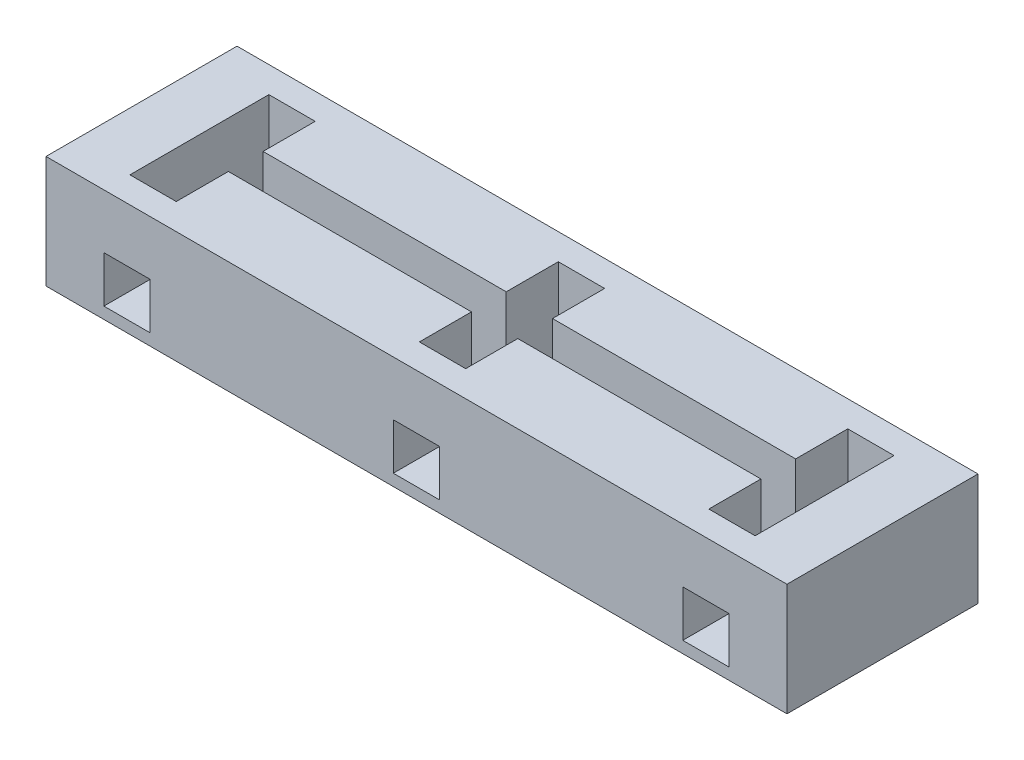
ISO-10303-21;
HEADER;
FILE_DESCRIPTION(('STEP AP214'),'2;1');
FILE_NAME('part.step','',(''),(''),'','','');
FILE_SCHEMA(('AUTOMOTIVE_DESIGN { 1 0 10303 214 1 1 1 1 }'));
ENDSEC;
DATA;
#1=APPLICATION_CONTEXT('core data for automotive mechanical design processes');
#2=APPLICATION_PROTOCOL_DEFINITION('international standard','automotive_design',2000,#1);
#3=PRODUCT_CONTEXT('',#1,'mechanical');
#4=PRODUCT('Part','Part','',(#3));
#5=PRODUCT_RELATED_PRODUCT_CATEGORY('part','',(#4));
#6=PRODUCT_DEFINITION_FORMATION('','',#4);
#7=PRODUCT_DEFINITION_CONTEXT('part definition',#1,'design');
#8=PRODUCT_DEFINITION('design','',#6,#7);
#9=PRODUCT_DEFINITION_SHAPE('','',#8);
#10=(LENGTH_UNIT() NAMED_UNIT(*) SI_UNIT(.MILLI.,.METRE.));
#11=(NAMED_UNIT(*) PLANE_ANGLE_UNIT() SI_UNIT($,.RADIAN.));
#12=(NAMED_UNIT(*) SI_UNIT($,.STERADIAN.) SOLID_ANGLE_UNIT());
#13=UNCERTAINTY_MEASURE_WITH_UNIT(LENGTH_MEASURE(1.E-05),#10,'distance_accuracy_value','');
#14=(GEOMETRIC_REPRESENTATION_CONTEXT(3) GLOBAL_UNCERTAINTY_ASSIGNED_CONTEXT((#13)) GLOBAL_UNIT_ASSIGNED_CONTEXT((#10,
#11,#12)) REPRESENTATION_CONTEXT('',''));
#15=CARTESIAN_POINT('',(0.,0.,0.));
#16=DIRECTION('',(0.,0.,1.));
#17=DIRECTION('',(1.,0.,0.));
#18=AXIS2_PLACEMENT_3D('',#15,#16,#17);
#19=CARTESIAN_POINT('',(-160.,-43.48,41.25));
#20=DIRECTION('',(0.,0.,1.));
#21=DIRECTION('',(1.,0.,0.));
#22=AXIS2_PLACEMENT_3D('',#19,#20,#21);
#23=PLANE('',#22);
#24=DIRECTION('',(-1.,0.,0.));
#25=VECTOR('',#24,1.);
#26=CARTESIAN_POINT('',(-160.,-43.48,41.25));
#27=LINE('',#26,#25);
#28=CARTESIAN_POINT('',(-115.,-43.48,41.25));
#29=VERTEX_POINT('',#28);
#30=CARTESIAN_POINT('',(-135.,-43.48,41.25));
#31=VERTEX_POINT('',#30);
#32=EDGE_CURVE('E261',#29,#31,#27,.T.);
#33=ORIENTED_EDGE('',*,*,#32,.T.);
#34=DIRECTION('',(0.,-1.,0.));
#35=VECTOR('',#34,1.);
#36=CARTESIAN_POINT('',(-135.,-43.48,41.25));
#37=LINE('',#36,#35);
#38=CARTESIAN_POINT('',(-135.,-23.48,41.25));
#39=VERTEX_POINT('',#38);
#40=EDGE_CURVE('E272',#39,#31,#37,.T.);
#41=ORIENTED_EDGE('',*,*,#40,.F.);
#42=DIRECTION('',(-1.,0.,0.));
#43=VECTOR('',#42,1.);
#44=CARTESIAN_POINT('',(-135.,-23.48,41.25));
#45=LINE('',#44,#43);
#46=CARTESIAN_POINT('',(-115.,-23.48,41.25));
#47=VERTEX_POINT('',#46);
#48=EDGE_CURVE('E277',#47,#39,#45,.T.);
#49=ORIENTED_EDGE('',*,*,#48,.F.);
#50=DIRECTION('',(0.,1.,0.));
#51=VECTOR('',#50,1.);
#52=CARTESIAN_POINT('',(-115.,-43.48,41.25));
#53=LINE('',#52,#51);
#54=EDGE_CURVE('E276',#29,#47,#53,.T.);
#55=ORIENTED_EDGE('',*,*,#54,.F.);
#56=EDGE_LOOP('',(#33,#41,#49,#55));
#57=FACE_BOUND('',#56,.T.);
#58=CARTESIAN_POINT('',(9.99999999999998,-43.48,41.25));
#59=VERTEX_POINT('',#58);
#60=CARTESIAN_POINT('',(-10.,-43.48,41.25));
#61=VERTEX_POINT('',#60);
#62=EDGE_CURVE('E264',#59,#61,#27,.T.);
#63=ORIENTED_EDGE('',*,*,#62,.T.);
#64=DIRECTION('',(0.,-1.,0.));
#65=VECTOR('',#64,1.);
#66=CARTESIAN_POINT('',(-10.,-43.48,41.25));
#67=LINE('',#66,#65);
#68=CARTESIAN_POINT('',(-10.,-23.48,41.25));
#69=VERTEX_POINT('',#68);
#70=EDGE_CURVE('E298',#69,#61,#67,.T.);
#71=ORIENTED_EDGE('',*,*,#70,.F.);
#72=DIRECTION('',(-1.,0.,0.));
#73=VECTOR('',#72,1.);
#74=CARTESIAN_POINT('',(-10.,-23.48,41.25));
#75=LINE('',#74,#73);
#76=CARTESIAN_POINT('',(9.99999999999998,-23.48,41.25));
#77=VERTEX_POINT('',#76);
#78=EDGE_CURVE('E295',#77,#69,#75,.T.);
#79=ORIENTED_EDGE('',*,*,#78,.F.);
#80=DIRECTION('',(0.,1.,0.));
#81=VECTOR('',#80,1.);
#82=CARTESIAN_POINT('',(9.99999999999998,-43.48,41.25));
#83=LINE('',#82,#81);
#84=EDGE_CURVE('E284',#59,#77,#83,.T.);
#85=ORIENTED_EDGE('',*,*,#84,.F.);
#86=EDGE_LOOP('',(#63,#71,#79,#85));
#87=FACE_BOUND('',#86,.T.);
#88=DIRECTION('',(-1.,0.,0.));
#89=VECTOR('',#88,1.);
#90=CARTESIAN_POINT('',(-160.,-48.48,41.25));
#91=LINE('',#90,#89);
#92=CARTESIAN_POINT('',(160.,-48.48,41.25));
#93=VERTEX_POINT('',#92);
#94=CARTESIAN_POINT('',(-160.,-48.48,41.25));
#95=VERTEX_POINT('',#94);
#96=EDGE_CURVE('E259',#93,#95,#91,.T.);
#97=ORIENTED_EDGE('',*,*,#96,.F.);
#98=DIRECTION('',(0.,1.,0.));
#99=VECTOR('',#98,1.);
#100=CARTESIAN_POINT('',(160.,-43.48,41.25));
#101=LINE('',#100,#99);
#102=CARTESIAN_POINT('',(160.,0.,41.25));
#103=VERTEX_POINT('',#102);
#104=EDGE_CURVE('E45',#93,#103,#101,.T.);
#105=ORIENTED_EDGE('',*,*,#104,.T.);
#106=DIRECTION('',(1.,0.,0.));
#107=VECTOR('',#106,1.);
#108=CARTESIAN_POINT('',(-160.,0.,41.25));
#109=LINE('',#108,#107);
#110=CARTESIAN_POINT('',(-160.,0.,41.25));
#111=VERTEX_POINT('',#110);
#112=EDGE_CURVE('E423',#111,#103,#109,.T.);
#113=ORIENTED_EDGE('',*,*,#112,.F.);
#114=DIRECTION('',(0.,1.,0.));
#115=VECTOR('',#114,1.);
#116=CARTESIAN_POINT('',(-160.,-43.48,41.25));
#117=LINE('',#116,#115);
#118=EDGE_CURVE('E11',#95,#111,#117,.T.);
#119=ORIENTED_EDGE('',*,*,#118,.F.);
#120=EDGE_LOOP('',(#97,#105,#113,#119));
#121=FACE_BOUND('',#120,.T.);
#122=DIRECTION('',(0.,1.,0.));
#123=VECTOR('',#122,1.);
#124=CARTESIAN_POINT('',(135.,-43.48,41.25));
#125=LINE('',#124,#123);
#126=CARTESIAN_POINT('',(135.,-43.48,41.25));
#127=VERTEX_POINT('',#126);
#128=CARTESIAN_POINT('',(135.,-23.48,41.25));
#129=VERTEX_POINT('',#128);
#130=EDGE_CURVE('E274',#127,#129,#125,.T.);
#131=ORIENTED_EDGE('',*,*,#130,.F.);
#132=CARTESIAN_POINT('',(115.,-43.48,41.25));
#133=VERTEX_POINT('',#132);
#134=EDGE_CURVE('E256',#127,#133,#27,.T.);
#135=ORIENTED_EDGE('',*,*,#134,.T.);
#136=DIRECTION('',(0.,-1.,0.));
#137=VECTOR('',#136,1.);
#138=CARTESIAN_POINT('',(115.,-43.48,41.25));
#139=LINE('',#138,#137);
#140=CARTESIAN_POINT('',(115.,-23.48,41.25));
#141=VERTEX_POINT('',#140);
#142=EDGE_CURVE('E283',#141,#133,#139,.T.);
#143=ORIENTED_EDGE('',*,*,#142,.F.);
#144=DIRECTION('',(-1.,0.,0.));
#145=VECTOR('',#144,1.);
#146=CARTESIAN_POINT('',(135.,-23.48,41.25));
#147=LINE('',#146,#145);
#148=EDGE_CURVE('E289',#129,#141,#147,.T.);
#149=ORIENTED_EDGE('',*,*,#148,.F.);
#150=EDGE_LOOP('',(#131,#135,#143,#149));
#151=FACE_BOUND('',#150,.T.);
#152=ADVANCED_FACE('F39',(#57,#87,#121,#151),#23,.T.);
#153=CARTESIAN_POINT('',(-160.,-43.48,41.25));
#154=DIRECTION('',(-1.,0.,0.));
#155=DIRECTION('',(0.,0.,1.));
#156=AXIS2_PLACEMENT_3D('',#153,#154,#155);
#157=PLANE('',#156);
#158=DIRECTION('',(0.,0.,1.));
#159=VECTOR('',#158,1.);
#160=CARTESIAN_POINT('',(-160.,0.,41.25));
#161=LINE('',#160,#159);
#162=CARTESIAN_POINT('',(-160.,0.,-41.25));
#163=VERTEX_POINT('',#162);
#164=EDGE_CURVE('E241',#163,#111,#161,.T.);
#165=ORIENTED_EDGE('',*,*,#164,.F.);
#166=DIRECTION('',(0.,1.,0.));
#167=VECTOR('',#166,1.);
#168=CARTESIAN_POINT('',(-160.,-43.48,-41.25));
#169=LINE('',#168,#167);
#170=CARTESIAN_POINT('',(-160.,-48.48,-41.25));
#171=VERTEX_POINT('',#170);
#172=EDGE_CURVE('E50',#171,#163,#169,.T.);
#173=ORIENTED_EDGE('',*,*,#172,.F.);
#174=DIRECTION('',(0.,0.,-1.));
#175=VECTOR('',#174,1.);
#176=CARTESIAN_POINT('',(-160.,-48.48,41.25));
#177=LINE('',#176,#175);
#178=EDGE_CURVE('E237',#95,#171,#177,.T.);
#179=ORIENTED_EDGE('',*,*,#178,.F.);
#180=ORIENTED_EDGE('',*,*,#118,.T.);
#181=EDGE_LOOP('',(#165,#173,#179,#180));
#182=FACE_BOUND('',#181,.T.);
#183=ADVANCED_FACE('F240',(#182),#157,.T.);
#184=CARTESIAN_POINT('',(-160.,-43.48,-41.25));
#185=DIRECTION('',(0.,0.,-1.));
#186=DIRECTION('',(-1.,0.,0.));
#187=AXIS2_PLACEMENT_3D('',#184,#185,#186);
#188=PLANE('',#187);
#189=DIRECTION('',(-1.,0.,0.));
#190=VECTOR('',#189,1.);
#191=CARTESIAN_POINT('',(-160.,0.,-41.25));
#192=LINE('',#191,#190);
#193=CARTESIAN_POINT('',(160.,0.,-41.25));
#194=VERTEX_POINT('',#193);
#195=EDGE_CURVE('E465',#194,#163,#192,.T.);
#196=ORIENTED_EDGE('',*,*,#195,.F.);
#197=DIRECTION('',(0.,1.,0.));
#198=VECTOR('',#197,1.);
#199=CARTESIAN_POINT('',(160.,-43.48,-41.25));
#200=LINE('',#199,#198);
#201=CARTESIAN_POINT('',(160.,-48.48,-41.25));
#202=VERTEX_POINT('',#201);
#203=EDGE_CURVE('E244',#202,#194,#200,.T.);
#204=ORIENTED_EDGE('',*,*,#203,.F.);
#205=DIRECTION('',(1.,0.,0.));
#206=VECTOR('',#205,1.);
#207=CARTESIAN_POINT('',(-160.,-48.48,-41.25));
#208=LINE('',#207,#206);
#209=EDGE_CURVE('E247',#171,#202,#208,.T.);
#210=ORIENTED_EDGE('',*,*,#209,.F.);
#211=ORIENTED_EDGE('',*,*,#172,.T.);
#212=EDGE_LOOP('',(#196,#204,#210,#211));
#213=FACE_BOUND('',#212,.T.);
#214=ADVANCED_FACE('F248',(#213),#188,.T.);
#215=CARTESIAN_POINT('',(160.,-43.48,41.25));
#216=DIRECTION('',(1.,0.,0.));
#217=DIRECTION('',(0.,0.,-1.));
#218=AXIS2_PLACEMENT_3D('',#215,#216,#217);
#219=PLANE('',#218);
#220=DIRECTION('',(0.,0.,-1.));
#221=VECTOR('',#220,1.);
#222=CARTESIAN_POINT('',(160.,0.,41.25));
#223=LINE('',#222,#221);
#224=EDGE_CURVE('E462',#103,#194,#223,.T.);
#225=ORIENTED_EDGE('',*,*,#224,.F.);
#226=ORIENTED_EDGE('',*,*,#104,.F.);
#227=DIRECTION('',(0.,0.,1.));
#228=VECTOR('',#227,1.);
#229=CARTESIAN_POINT('',(160.,-48.48,41.25));
#230=LINE('',#229,#228);
#231=EDGE_CURVE('E254',#202,#93,#230,.T.);
#232=ORIENTED_EDGE('',*,*,#231,.F.);
#233=ORIENTED_EDGE('',*,*,#203,.T.);
#234=EDGE_LOOP('',(#225,#226,#232,#233));
#235=FACE_BOUND('',#234,.T.);
#236=ADVANCED_FACE('F475',(#235),#219,.T.);
#237=CARTESIAN_POINT('',(0.,0.,0.));
#238=DIRECTION('',(0.,1.,0.));
#239=DIRECTION('',(0.,0.,1.));
#240=AXIS2_PLACEMENT_3D('',#237,#238,#239);
#241=PLANE('',#240);
#242=DIRECTION('',(-1.,0.,0.));
#243=VECTOR('',#242,1.);
#244=CARTESIAN_POINT('',(115.,0.,-7.49999999999994));
#245=LINE('',#244,#243);
#246=CARTESIAN_POINT('',(115.,0.,-7.49999999999994));
#247=VERTEX_POINT('',#246);
#248=CARTESIAN_POINT('',(9.99999999999994,0.,-7.50000000000011));
#249=VERTEX_POINT('',#248);
#250=EDGE_CURVE('E308',#247,#249,#245,.T.);
#251=ORIENTED_EDGE('',*,*,#250,.F.);
#252=DIRECTION('',(0.,0.,1.));
#253=VECTOR('',#252,1.);
#254=CARTESIAN_POINT('',(115.,0.,-30.));
#255=LINE('',#254,#253);
#256=CARTESIAN_POINT('',(115.,0.,-30.));
#257=VERTEX_POINT('',#256);
#258=EDGE_CURVE('E312',#257,#247,#255,.T.);
#259=ORIENTED_EDGE('',*,*,#258,.F.);
#260=DIRECTION('',(-1.,0.,0.));
#261=VECTOR('',#260,1.);
#262=CARTESIAN_POINT('',(135.,0.,-30.));
#263=LINE('',#262,#261);
#264=CARTESIAN_POINT('',(135.,0.,-30.));
#265=VERTEX_POINT('',#264);
#266=EDGE_CURVE('E411',#265,#257,#263,.T.);
#267=ORIENTED_EDGE('',*,*,#266,.F.);
#268=DIRECTION('',(0.,0.,-1.));
#269=VECTOR('',#268,1.);
#270=CARTESIAN_POINT('',(135.,0.,-30.));
#271=LINE('',#270,#269);
#272=CARTESIAN_POINT('',(135.,0.,30.));
#273=VERTEX_POINT('',#272);
#274=EDGE_CURVE('E412',#273,#265,#271,.T.);
#275=ORIENTED_EDGE('',*,*,#274,.F.);
#276=DIRECTION('',(1.,0.,0.));
#277=VECTOR('',#276,1.);
#278=CARTESIAN_POINT('',(135.,0.,30.));
#279=LINE('',#278,#277);
#280=CARTESIAN_POINT('',(115.,0.,30.));
#281=VERTEX_POINT('',#280);
#282=EDGE_CURVE('E409',#281,#273,#279,.T.);
#283=ORIENTED_EDGE('',*,*,#282,.F.);
#284=DIRECTION('',(0.,0.,1.));
#285=VECTOR('',#284,1.);
#286=CARTESIAN_POINT('',(115.,0.,30.));
#287=LINE('',#286,#285);
#288=CARTESIAN_POINT('',(115.,0.,7.49999999999994));
#289=VERTEX_POINT('',#288);
#290=EDGE_CURVE('E403',#289,#281,#287,.T.);
#291=ORIENTED_EDGE('',*,*,#290,.F.);
#292=DIRECTION('',(1.,0.,0.));
#293=VECTOR('',#292,1.);
#294=CARTESIAN_POINT('',(115.,0.,7.49999999999994));
#295=LINE('',#294,#293);
#296=CARTESIAN_POINT('',(9.99999999999994,0.,7.50000000000011));
#297=VERTEX_POINT('',#296);
#298=EDGE_CURVE('E405',#297,#289,#295,.T.);
#299=ORIENTED_EDGE('',*,*,#298,.F.);
#300=DIRECTION('',(0.,0.,-1.));
#301=VECTOR('',#300,1.);
#302=CARTESIAN_POINT('',(9.99999999999979,0.,30.0000000000001));
#303=LINE('',#302,#301);
#304=CARTESIAN_POINT('',(9.99999999999979,0.,30.0000000000001));
#305=VERTEX_POINT('',#304);
#306=EDGE_CURVE('E398',#305,#297,#303,.T.);
#307=ORIENTED_EDGE('',*,*,#306,.F.);
#308=DIRECTION('',(1.,0.,0.));
#309=VECTOR('',#308,1.);
#310=CARTESIAN_POINT('',(-10.,0.,30.));
#311=LINE('',#310,#309);
#312=CARTESIAN_POINT('',(-10.,0.,30.));
#313=VERTEX_POINT('',#312);
#314=EDGE_CURVE('E396',#313,#305,#311,.T.);
#315=ORIENTED_EDGE('',*,*,#314,.F.);
#316=DIRECTION('',(0.,0.,1.));
#317=VECTOR('',#316,1.);
#318=CARTESIAN_POINT('',(-10.,0.,30.));
#319=LINE('',#318,#317);
#320=CARTESIAN_POINT('',(-10.,0.,7.5));
#321=VERTEX_POINT('',#320);
#322=EDGE_CURVE('E395',#321,#313,#319,.T.);
#323=ORIENTED_EDGE('',*,*,#322,.F.);
#324=DIRECTION('',(1.,0.,0.));
#325=VECTOR('',#324,1.);
#326=CARTESIAN_POINT('',(-115.,0.,7.49999999999994));
#327=LINE('',#326,#325);
#328=CARTESIAN_POINT('',(-115.,0.,7.49999999999994));
#329=VERTEX_POINT('',#328);
#330=EDGE_CURVE('E388',#329,#321,#327,.T.);
#331=ORIENTED_EDGE('',*,*,#330,.F.);
#332=DIRECTION('',(0.,0.,-1.));
#333=VECTOR('',#332,1.);
#334=CARTESIAN_POINT('',(-115.,0.,30.));
#335=LINE('',#334,#333);
#336=CARTESIAN_POINT('',(-115.,0.,30.));
#337=VERTEX_POINT('',#336);
#338=EDGE_CURVE('E390',#337,#329,#335,.T.);
#339=ORIENTED_EDGE('',*,*,#338,.F.);
#340=DIRECTION('',(1.,0.,0.));
#341=VECTOR('',#340,1.);
#342=CARTESIAN_POINT('',(-135.,0.,30.));
#343=LINE('',#342,#341);
#344=CARTESIAN_POINT('',(-135.,0.,30.));
#345=VERTEX_POINT('',#344);
#346=EDGE_CURVE('E381',#345,#337,#343,.T.);
#347=ORIENTED_EDGE('',*,*,#346,.F.);
#348=DIRECTION('',(0.,0.,1.));
#349=VECTOR('',#348,1.);
#350=CARTESIAN_POINT('',(-135.,0.,-30.));
#351=LINE('',#350,#349);
#352=CARTESIAN_POINT('',(-135.,0.,-30.));
#353=VERTEX_POINT('',#352);
#354=EDGE_CURVE('E382',#353,#345,#351,.T.);
#355=ORIENTED_EDGE('',*,*,#354,.F.);
#356=DIRECTION('',(-1.,0.,0.));
#357=VECTOR('',#356,1.);
#358=CARTESIAN_POINT('',(-135.,0.,-30.));
#359=LINE('',#358,#357);
#360=CARTESIAN_POINT('',(-115.,0.,-30.));
#361=VERTEX_POINT('',#360);
#362=EDGE_CURVE('E377',#361,#353,#359,.T.);
#363=ORIENTED_EDGE('',*,*,#362,.F.);
#364=DIRECTION('',(0.,0.,-1.));
#365=VECTOR('',#364,1.);
#366=CARTESIAN_POINT('',(-115.,0.,-30.));
#367=LINE('',#366,#365);
#368=CARTESIAN_POINT('',(-115.,0.,-7.49999999999994));
#369=VERTEX_POINT('',#368);
#370=EDGE_CURVE('E374',#369,#361,#367,.T.);
#371=ORIENTED_EDGE('',*,*,#370,.F.);
#372=DIRECTION('',(-1.,0.,0.));
#373=VECTOR('',#372,1.);
#374=CARTESIAN_POINT('',(-115.,0.,-7.49999999999994));
#375=LINE('',#374,#373);
#376=CARTESIAN_POINT('',(-10.,0.,-7.5));
#377=VERTEX_POINT('',#376);
#378=EDGE_CURVE('E375',#377,#369,#375,.T.);
#379=ORIENTED_EDGE('',*,*,#378,.F.);
#380=DIRECTION('',(0.,0.,1.));
#381=VECTOR('',#380,1.);
#382=CARTESIAN_POINT('',(-10.,0.,-30.));
#383=LINE('',#382,#381);
#384=CARTESIAN_POINT('',(-10.,0.,-30.));
#385=VERTEX_POINT('',#384);
#386=EDGE_CURVE('E367',#385,#377,#383,.T.);
#387=ORIENTED_EDGE('',*,*,#386,.F.);
#388=DIRECTION('',(-1.,0.,0.));
#389=VECTOR('',#388,1.);
#390=CARTESIAN_POINT('',(-10.,0.,-30.));
#391=LINE('',#390,#389);
#392=CARTESIAN_POINT('',(9.99999999999979,0.,-30.0000000000001));
#393=VERTEX_POINT('',#392);
#394=EDGE_CURVE('E366',#393,#385,#391,.T.);
#395=ORIENTED_EDGE('',*,*,#394,.F.);
#396=DIRECTION('',(0.,0.,-1.));
#397=VECTOR('',#396,1.);
#398=CARTESIAN_POINT('',(9.99999999999979,0.,-30.0000000000001));
#399=LINE('',#398,#397);
#400=EDGE_CURVE('E361',#249,#393,#399,.T.);
#401=ORIENTED_EDGE('',*,*,#400,.F.);
#402=EDGE_LOOP('',(#251,#259,#267,#275,#283,#291,#299,#307,#315,#323,#331,#339,#347,#355,#363,
#371,#379,#387,#395,#401));
#403=FACE_BOUND('',#402,.T.);
#404=ORIENTED_EDGE('',*,*,#112,.T.);
#405=ORIENTED_EDGE('',*,*,#224,.T.);
#406=ORIENTED_EDGE('',*,*,#195,.T.);
#407=ORIENTED_EDGE('',*,*,#164,.T.);
#408=EDGE_LOOP('',(#404,#405,#406,#407));
#409=FACE_BOUND('',#408,.T.);
#410=ADVANCED_FACE('F471',(#403,#409),#241,.T.);
#411=CARTESIAN_POINT('',(115.,-43.48,-7.49999999999994));
#412=DIRECTION('',(0.,0.,-1.));
#413=DIRECTION('',(-1.,0.,0.));
#414=AXIS2_PLACEMENT_3D('',#411,#412,#413);
#415=PLANE('',#414);
#416=ORIENTED_EDGE('',*,*,#250,.T.);
#417=DIRECTION('',(0.,1.,0.));
#418=VECTOR('',#417,1.);
#419=CARTESIAN_POINT('',(9.99999999999994,-43.48,-7.50000000000011));
#420=LINE('',#419,#418);
#421=CARTESIAN_POINT('',(9.99999999999994,-43.48,-7.50000000000011));
#422=VERTEX_POINT('',#421);
#423=EDGE_CURVE('E363',#422,#249,#420,.T.);
#424=ORIENTED_EDGE('',*,*,#423,.F.);
#425=DIRECTION('',(-1.,0.,0.));
#426=VECTOR('',#425,1.);
#427=CARTESIAN_POINT('',(115.,-43.48,-7.49999999999994));
#428=LINE('',#427,#426);
#429=CARTESIAN_POINT('',(115.,-43.48,-7.49999999999994));
#430=VERTEX_POINT('',#429);
#431=EDGE_CURVE('E307',#430,#422,#428,.T.);
#432=ORIENTED_EDGE('',*,*,#431,.F.);
#433=DIRECTION('',(0.,1.,0.));
#434=VECTOR('',#433,1.);
#435=CARTESIAN_POINT('',(115.,-43.48,-7.49999999999994));
#436=LINE('',#435,#434);
#437=EDGE_CURVE('E418',#430,#247,#436,.T.);
#438=ORIENTED_EDGE('',*,*,#437,.T.);
#439=EDGE_LOOP('',(#416,#424,#432,#438));
#440=FACE_BOUND('',#439,.T.);
#441=ADVANCED_FACE('F477',(#440),#415,.F.);
#442=CARTESIAN_POINT('',(115.,-43.48,-30.));
#443=DIRECTION('',(-1.,0.,0.));
#444=DIRECTION('',(0.,0.,1.));
#445=AXIS2_PLACEMENT_3D('',#442,#443,#444);
#446=PLANE('',#445);
#447=ORIENTED_EDGE('',*,*,#258,.T.);
#448=ORIENTED_EDGE('',*,*,#437,.F.);
#449=DIRECTION('',(0.,0.,1.));
#450=VECTOR('',#449,1.);
#451=CARTESIAN_POINT('',(115.,-43.48,-30.));
#452=LINE('',#451,#450);
#453=CARTESIAN_POINT('',(115.,-43.48,-30.));
#454=VERTEX_POINT('',#453);
#455=EDGE_CURVE('E356',#454,#430,#452,.T.);
#456=ORIENTED_EDGE('',*,*,#455,.F.);
#457=DIRECTION('',(0.,1.,0.));
#458=VECTOR('',#457,1.);
#459=CARTESIAN_POINT('',(115.,-43.48,-30.));
#460=LINE('',#459,#458);
#461=EDGE_CURVE('E422',#454,#257,#460,.T.);
#462=ORIENTED_EDGE('',*,*,#461,.T.);
#463=EDGE_LOOP('',(#447,#448,#456,#462));
#464=FACE_BOUND('',#463,.T.);
#465=ADVANCED_FACE('F484',(#464),#446,.F.);
#466=CARTESIAN_POINT('',(135.,-43.48,-30.));
#467=DIRECTION('',(0.,0.,-1.));
#468=DIRECTION('',(-1.,0.,0.));
#469=AXIS2_PLACEMENT_3D('',#466,#467,#468);
#470=PLANE('',#469);
#471=ORIENTED_EDGE('',*,*,#266,.T.);
#472=ORIENTED_EDGE('',*,*,#461,.F.);
#473=DIRECTION('',(-1.,0.,0.));
#474=VECTOR('',#473,1.);
#475=CARTESIAN_POINT('',(135.,-43.48,-30.));
#476=LINE('',#475,#474);
#477=CARTESIAN_POINT('',(135.,-43.48,-30.));
#478=VERTEX_POINT('',#477);
#479=EDGE_CURVE('E355',#478,#454,#476,.T.);
#480=ORIENTED_EDGE('',*,*,#479,.F.);
#481=DIRECTION('',(0.,1.,0.));
#482=VECTOR('',#481,1.);
#483=CARTESIAN_POINT('',(135.,-43.48,-30.));
#484=LINE('',#483,#482);
#485=EDGE_CURVE('E425',#478,#265,#484,.T.);
#486=ORIENTED_EDGE('',*,*,#485,.T.);
#487=EDGE_LOOP('',(#471,#472,#480,#486));
#488=FACE_BOUND('',#487,.T.);
#489=ADVANCED_FACE('F534',(#488),#470,.F.);
#490=CARTESIAN_POINT('',(135.,-43.48,-30.));
#491=DIRECTION('',(1.,0.,0.));
#492=DIRECTION('',(0.,0.,-1.));
#493=AXIS2_PLACEMENT_3D('',#490,#491,#492);
#494=PLANE('',#493);
#495=DIRECTION('',(0.,0.,1.));
#496=VECTOR('',#495,1.);
#497=CARTESIAN_POINT('',(135.,-23.48,26.25));
#498=LINE('',#497,#496);
#499=CARTESIAN_POINT('',(135.,-23.48,30.));
#500=VERTEX_POINT('',#499);
#501=EDGE_CURVE('E285',#500,#129,#498,.T.);
#502=ORIENTED_EDGE('',*,*,#501,.F.);
#503=DIRECTION('',(0.,1.,0.));
#504=VECTOR('',#503,1.);
#505=CARTESIAN_POINT('',(135.,-43.48,30.));
#506=LINE('',#505,#504);
#507=EDGE_CURVE('E428',#500,#273,#506,.T.);
#508=ORIENTED_EDGE('',*,*,#507,.T.);
#509=ORIENTED_EDGE('',*,*,#274,.T.);
#510=ORIENTED_EDGE('',*,*,#485,.F.);
#511=DIRECTION('',(0.,0.,-1.));
#512=VECTOR('',#511,1.);
#513=CARTESIAN_POINT('',(135.,-43.48,-30.));
#514=LINE('',#513,#512);
#515=EDGE_CURVE('E352',#127,#478,#514,.T.);
#516=ORIENTED_EDGE('',*,*,#515,.F.);
#517=ORIENTED_EDGE('',*,*,#130,.T.);
#518=EDGE_LOOP('',(#502,#508,#509,#510,#516,#517));
#519=FACE_BOUND('',#518,.T.);
#520=ADVANCED_FACE('F528',(#519),#494,.F.);
#521=CARTESIAN_POINT('',(135.,-43.48,30.));
#522=DIRECTION('',(0.,0.,1.));
#523=DIRECTION('',(1.,0.,0.));
#524=AXIS2_PLACEMENT_3D('',#521,#522,#523);
#525=PLANE('',#524);
#526=ORIENTED_EDGE('',*,*,#507,.F.);
#527=DIRECTION('',(-1.,0.,0.));
#528=VECTOR('',#527,1.);
#529=CARTESIAN_POINT('',(135.,-23.48,30.));
#530=LINE('',#529,#528);
#531=CARTESIAN_POINT('',(115.,-23.48,30.));
#532=VERTEX_POINT('',#531);
#533=EDGE_CURVE('E306',#500,#532,#530,.T.);
#534=ORIENTED_EDGE('',*,*,#533,.T.);
#535=DIRECTION('',(0.,1.,0.));
#536=VECTOR('',#535,1.);
#537=CARTESIAN_POINT('',(115.,-43.48,30.));
#538=LINE('',#537,#536);
#539=EDGE_CURVE('E426',#532,#281,#538,.T.);
#540=ORIENTED_EDGE('',*,*,#539,.T.);
#541=ORIENTED_EDGE('',*,*,#282,.T.);
#542=EDGE_LOOP('',(#526,#534,#540,#541));
#543=FACE_BOUND('',#542,.T.);
#544=ADVANCED_FACE('F632',(#543),#525,.F.);
#545=CARTESIAN_POINT('',(115.,-43.48,30.));
#546=DIRECTION('',(-1.,0.,0.));
#547=DIRECTION('',(0.,0.,1.));
#548=AXIS2_PLACEMENT_3D('',#545,#546,#547);
#549=PLANE('',#548);
#550=ORIENTED_EDGE('',*,*,#539,.F.);
#551=DIRECTION('',(0.,0.,1.));
#552=VECTOR('',#551,1.);
#553=CARTESIAN_POINT('',(115.,-23.48,26.25));
#554=LINE('',#553,#552);
#555=EDGE_CURVE('E54',#532,#141,#554,.T.);
#556=ORIENTED_EDGE('',*,*,#555,.T.);
#557=ORIENTED_EDGE('',*,*,#142,.T.);
#558=DIRECTION('',(0.,0.,1.));
#559=VECTOR('',#558,1.);
#560=CARTESIAN_POINT('',(115.,-43.48,30.));
#561=LINE('',#560,#559);
#562=CARTESIAN_POINT('',(115.,-43.48,7.49999999999994));
#563=VERTEX_POINT('',#562);
#564=EDGE_CURVE('E346',#563,#133,#561,.T.);
#565=ORIENTED_EDGE('',*,*,#564,.F.);
#566=DIRECTION('',(0.,1.,0.));
#567=VECTOR('',#566,1.);
#568=CARTESIAN_POINT('',(115.,-43.48,7.49999999999994));
#569=LINE('',#568,#567);
#570=EDGE_CURVE('E427',#563,#289,#569,.T.);
#571=ORIENTED_EDGE('',*,*,#570,.T.);
#572=ORIENTED_EDGE('',*,*,#290,.T.);
#573=EDGE_LOOP('',(#550,#556,#557,#565,#571,#572));
#574=FACE_BOUND('',#573,.T.);
#575=ADVANCED_FACE('F636',(#574),#549,.F.);
#576=CARTESIAN_POINT('',(115.,-43.48,7.49999999999994));
#577=DIRECTION('',(0.,0.,1.));
#578=DIRECTION('',(1.,0.,0.));
#579=AXIS2_PLACEMENT_3D('',#576,#577,#578);
#580=PLANE('',#579);
#581=ORIENTED_EDGE('',*,*,#298,.T.);
#582=ORIENTED_EDGE('',*,*,#570,.F.);
#583=DIRECTION('',(1.,0.,0.));
#584=VECTOR('',#583,1.);
#585=CARTESIAN_POINT('',(115.,-43.48,7.49999999999994));
#586=LINE('',#585,#584);
#587=CARTESIAN_POINT('',(9.99999999999994,-43.48,7.50000000000012));
#588=VERTEX_POINT('',#587);
#589=EDGE_CURVE('E347',#588,#563,#586,.T.);
#590=ORIENTED_EDGE('',*,*,#589,.F.);
#591=DIRECTION('',(0.,1.,0.));
#592=VECTOR('',#591,1.);
#593=CARTESIAN_POINT('',(9.99999999999994,-43.48,7.50000000000011));
#594=LINE('',#593,#592);
#595=EDGE_CURVE('E435',#588,#297,#594,.T.);
#596=ORIENTED_EDGE('',*,*,#595,.T.);
#597=EDGE_LOOP('',(#581,#582,#590,#596));
#598=FACE_BOUND('',#597,.T.);
#599=ADVANCED_FACE('F516',(#598),#580,.F.);
#600=CARTESIAN_POINT('',(9.99999999999979,-43.48,30.0000000000001));
#601=DIRECTION('',(1.,0.,0.));
#602=DIRECTION('',(0.,0.,-1.));
#603=AXIS2_PLACEMENT_3D('',#600,#601,#602);
#604=PLANE('',#603);
#605=DIRECTION('',(0.,0.,1.));
#606=VECTOR('',#605,1.);
#607=CARTESIAN_POINT('',(9.99999999999998,-23.48,26.25));
#608=LINE('',#607,#606);
#609=CARTESIAN_POINT('',(9.99999999999998,-23.48,30.0000000000001));
#610=VERTEX_POINT('',#609);
#611=EDGE_CURVE('E296',#610,#77,#608,.T.);
#612=ORIENTED_EDGE('',*,*,#611,.F.);
#613=DIRECTION('',(0.,1.,0.));
#614=VECTOR('',#613,1.);
#615=CARTESIAN_POINT('',(9.99999999999979,-43.48,30.0000000000001));
#616=LINE('',#615,#614);
#617=EDGE_CURVE('E432',#610,#305,#616,.T.);
#618=ORIENTED_EDGE('',*,*,#617,.T.);
#619=ORIENTED_EDGE('',*,*,#306,.T.);
#620=ORIENTED_EDGE('',*,*,#595,.F.);
#621=DIRECTION('',(0.,0.,-1.));
#622=VECTOR('',#621,1.);
#623=CARTESIAN_POINT('',(9.99999999999979,-43.48,30.0000000000001));
#624=LINE('',#623,#622);
#625=EDGE_CURVE('E344',#59,#588,#624,.T.);
#626=ORIENTED_EDGE('',*,*,#625,.F.);
#627=ORIENTED_EDGE('',*,*,#84,.T.);
#628=EDGE_LOOP('',(#612,#618,#619,#620,#626,#627));
#629=FACE_BOUND('',#628,.T.);
#630=ADVANCED_FACE('F511',(#629),#604,.F.);
#631=CARTESIAN_POINT('',(-10.,-43.48,30.));
#632=DIRECTION('',(0.,0.,1.));
#633=DIRECTION('',(1.,0.,0.));
#634=AXIS2_PLACEMENT_3D('',#631,#632,#633);
#635=PLANE('',#634);
#636=ORIENTED_EDGE('',*,*,#617,.F.);
#637=DIRECTION('',(-1.,0.,0.));
#638=VECTOR('',#637,1.);
#639=CARTESIAN_POINT('',(-10.,-23.48,30.));
#640=LINE('',#639,#638);
#641=CARTESIAN_POINT('',(-10.,-23.48,30.));
#642=VERTEX_POINT('',#641);
#643=EDGE_CURVE('E302',#610,#642,#640,.T.);
#644=ORIENTED_EDGE('',*,*,#643,.T.);
#645=DIRECTION('',(0.,1.,0.));
#646=VECTOR('',#645,1.);
#647=CARTESIAN_POINT('',(-10.,-43.48,30.));
#648=LINE('',#647,#646);
#649=EDGE_CURVE('E436',#642,#313,#648,.T.);
#650=ORIENTED_EDGE('',*,*,#649,.T.);
#651=ORIENTED_EDGE('',*,*,#314,.T.);
#652=EDGE_LOOP('',(#636,#644,#650,#651));
#653=FACE_BOUND('',#652,.T.);
#654=ADVANCED_FACE('F585',(#653),#635,.F.);
#655=CARTESIAN_POINT('',(-10.,-43.48,30.));
#656=DIRECTION('',(-1.,0.,0.));
#657=DIRECTION('',(0.,0.,1.));
#658=AXIS2_PLACEMENT_3D('',#655,#656,#657);
#659=PLANE('',#658);
#660=ORIENTED_EDGE('',*,*,#649,.F.);
#661=DIRECTION('',(0.,0.,1.));
#662=VECTOR('',#661,1.);
#663=CARTESIAN_POINT('',(-10.,-23.48,26.25));
#664=LINE('',#663,#662);
#665=EDGE_CURVE('E64',#642,#69,#664,.T.);
#666=ORIENTED_EDGE('',*,*,#665,.T.);
#667=ORIENTED_EDGE('',*,*,#70,.T.);
#668=DIRECTION('',(0.,0.,1.));
#669=VECTOR('',#668,1.);
#670=CARTESIAN_POINT('',(-10.,-43.48,30.));
#671=LINE('',#670,#669);
#672=CARTESIAN_POINT('',(-10.,-43.48,7.5));
#673=VERTEX_POINT('',#672);
#674=EDGE_CURVE('E338',#673,#61,#671,.T.);
#675=ORIENTED_EDGE('',*,*,#674,.F.);
#676=DIRECTION('',(0.,1.,0.));
#677=VECTOR('',#676,1.);
#678=CARTESIAN_POINT('',(-10.,-43.48,7.5));
#679=LINE('',#678,#677);
#680=EDGE_CURVE('E438',#673,#321,#679,.T.);
#681=ORIENTED_EDGE('',*,*,#680,.T.);
#682=ORIENTED_EDGE('',*,*,#322,.T.);
#683=EDGE_LOOP('',(#660,#666,#667,#675,#681,#682));
#684=FACE_BOUND('',#683,.T.);
#685=ADVANCED_FACE('F508',(#684),#659,.F.);
#686=CARTESIAN_POINT('',(-115.,-43.48,7.49999999999994));
#687=DIRECTION('',(0.,0.,1.));
#688=DIRECTION('',(1.,0.,0.));
#689=AXIS2_PLACEMENT_3D('',#686,#687,#688);
#690=PLANE('',#689);
#691=ORIENTED_EDGE('',*,*,#330,.T.);
#692=ORIENTED_EDGE('',*,*,#680,.F.);
#693=DIRECTION('',(1.,0.,0.));
#694=VECTOR('',#693,1.);
#695=CARTESIAN_POINT('',(-115.,-43.48,7.49999999999994));
#696=LINE('',#695,#694);
#697=CARTESIAN_POINT('',(-115.,-43.48,7.49999999999994));
#698=VERTEX_POINT('',#697);
#699=EDGE_CURVE('E340',#698,#673,#696,.T.);
#700=ORIENTED_EDGE('',*,*,#699,.F.);
#701=DIRECTION('',(0.,1.,0.));
#702=VECTOR('',#701,1.);
#703=CARTESIAN_POINT('',(-115.,-43.48,7.49999999999994));
#704=LINE('',#703,#702);
#705=EDGE_CURVE('E439',#698,#329,#704,.T.);
#706=ORIENTED_EDGE('',*,*,#705,.T.);
#707=EDGE_LOOP('',(#691,#692,#700,#706));
#708=FACE_BOUND('',#707,.T.);
#709=ADVANCED_FACE('F579',(#708),#690,.F.);
#710=CARTESIAN_POINT('',(-115.,-43.48,30.));
#711=DIRECTION('',(1.,0.,0.));
#712=DIRECTION('',(0.,0.,-1.));
#713=AXIS2_PLACEMENT_3D('',#710,#711,#712);
#714=PLANE('',#713);
#715=DIRECTION('',(0.,0.,1.));
#716=VECTOR('',#715,1.);
#717=CARTESIAN_POINT('',(-115.,-23.48,26.25));
#718=LINE('',#717,#716);
#719=CARTESIAN_POINT('',(-115.,-23.48,30.));
#720=VERTEX_POINT('',#719);
#721=EDGE_CURVE('E268',#720,#47,#718,.T.);
#722=ORIENTED_EDGE('',*,*,#721,.F.);
#723=DIRECTION('',(0.,1.,0.));
#724=VECTOR('',#723,1.);
#725=CARTESIAN_POINT('',(-115.,-43.48,30.));
#726=LINE('',#725,#724);
#727=EDGE_CURVE('E445',#720,#337,#726,.T.);
#728=ORIENTED_EDGE('',*,*,#727,.T.);
#729=ORIENTED_EDGE('',*,*,#338,.T.);
#730=ORIENTED_EDGE('',*,*,#705,.F.);
#731=DIRECTION('',(0.,0.,-1.));
#732=VECTOR('',#731,1.);
#733=CARTESIAN_POINT('',(-115.,-43.48,30.));
#734=LINE('',#733,#732);
#735=EDGE_CURVE('E333',#29,#698,#734,.T.);
#736=ORIENTED_EDGE('',*,*,#735,.F.);
#737=ORIENTED_EDGE('',*,*,#54,.T.);
#738=EDGE_LOOP('',(#722,#728,#729,#730,#736,#737));
#739=FACE_BOUND('',#738,.T.);
#740=ADVANCED_FACE('F572',(#739),#714,.F.);
#741=CARTESIAN_POINT('',(-135.,-43.48,30.));
#742=DIRECTION('',(0.,0.,1.));
#743=DIRECTION('',(1.,0.,0.));
#744=AXIS2_PLACEMENT_3D('',#741,#742,#743);
#745=PLANE('',#744);
#746=ORIENTED_EDGE('',*,*,#727,.F.);
#747=DIRECTION('',(-1.,0.,0.));
#748=VECTOR('',#747,1.);
#749=CARTESIAN_POINT('',(-135.,-23.48,30.));
#750=LINE('',#749,#748);
#751=CARTESIAN_POINT('',(-135.,-23.48,30.));
#752=VERTEX_POINT('',#751);
#753=EDGE_CURVE('E297',#720,#752,#750,.T.);
#754=ORIENTED_EDGE('',*,*,#753,.T.);
#755=DIRECTION('',(0.,1.,0.));
#756=VECTOR('',#755,1.);
#757=CARTESIAN_POINT('',(-135.,-43.48,30.));
#758=LINE('',#757,#756);
#759=EDGE_CURVE('E443',#752,#345,#758,.T.);
#760=ORIENTED_EDGE('',*,*,#759,.T.);
#761=ORIENTED_EDGE('',*,*,#346,.T.);
#762=EDGE_LOOP('',(#746,#754,#760,#761));
#763=FACE_BOUND('',#762,.T.);
#764=ADVANCED_FACE('F596',(#763),#745,.F.);
#765=CARTESIAN_POINT('',(-135.,-43.48,-30.));
#766=DIRECTION('',(-1.,0.,0.));
#767=DIRECTION('',(0.,0.,1.));
#768=AXIS2_PLACEMENT_3D('',#765,#766,#767);
#769=PLANE('',#768);
#770=ORIENTED_EDGE('',*,*,#759,.F.);
#771=DIRECTION('',(0.,0.,1.));
#772=VECTOR('',#771,1.);
#773=CARTESIAN_POINT('',(-135.,-23.48,26.25));
#774=LINE('',#773,#772);
#775=EDGE_CURVE('E275',#752,#39,#774,.T.);
#776=ORIENTED_EDGE('',*,*,#775,.T.);
#777=ORIENTED_EDGE('',*,*,#40,.T.);
#778=DIRECTION('',(0.,0.,1.));
#779=VECTOR('',#778,1.);
#780=CARTESIAN_POINT('',(-135.,-43.48,-30.));
#781=LINE('',#780,#779);
#782=CARTESIAN_POINT('',(-135.,-43.48,-30.));
#783=VERTEX_POINT('',#782);
#784=EDGE_CURVE('E331',#783,#31,#781,.T.);
#785=ORIENTED_EDGE('',*,*,#784,.F.);
#786=DIRECTION('',(0.,1.,0.));
#787=VECTOR('',#786,1.);
#788=CARTESIAN_POINT('',(-135.,-43.48,-30.));
#789=LINE('',#788,#787);
#790=EDGE_CURVE('E447',#783,#353,#789,.T.);
#791=ORIENTED_EDGE('',*,*,#790,.T.);
#792=ORIENTED_EDGE('',*,*,#354,.T.);
#793=EDGE_LOOP('',(#770,#776,#777,#785,#791,#792));
#794=FACE_BOUND('',#793,.T.);
#795=ADVANCED_FACE('F566',(#794),#769,.F.);
#796=CARTESIAN_POINT('',(-135.,-43.48,-30.));
#797=DIRECTION('',(0.,0.,-1.));
#798=DIRECTION('',(-1.,0.,0.));
#799=AXIS2_PLACEMENT_3D('',#796,#797,#798);
#800=PLANE('',#799);
#801=ORIENTED_EDGE('',*,*,#362,.T.);
#802=ORIENTED_EDGE('',*,*,#790,.F.);
#803=DIRECTION('',(-1.,0.,0.));
#804=VECTOR('',#803,1.);
#805=CARTESIAN_POINT('',(-135.,-43.48,-30.));
#806=LINE('',#805,#804);
#807=CARTESIAN_POINT('',(-115.,-43.48,-30.));
#808=VERTEX_POINT('',#807);
#809=EDGE_CURVE('E330',#808,#783,#806,.T.);
#810=ORIENTED_EDGE('',*,*,#809,.F.);
#811=DIRECTION('',(0.,1.,0.));
#812=VECTOR('',#811,1.);
#813=CARTESIAN_POINT('',(-115.,-43.48,-30.));
#814=LINE('',#813,#812);
#815=EDGE_CURVE('E449',#808,#361,#814,.T.);
#816=ORIENTED_EDGE('',*,*,#815,.T.);
#817=EDGE_LOOP('',(#801,#802,#810,#816));
#818=FACE_BOUND('',#817,.T.);
#819=ADVANCED_FACE('F565',(#818),#800,.F.);
#820=CARTESIAN_POINT('',(-115.,-43.48,-30.));
#821=DIRECTION('',(1.,0.,0.));
#822=DIRECTION('',(0.,0.,-1.));
#823=AXIS2_PLACEMENT_3D('',#820,#821,#822);
#824=PLANE('',#823);
#825=ORIENTED_EDGE('',*,*,#370,.T.);
#826=ORIENTED_EDGE('',*,*,#815,.F.);
#827=DIRECTION('',(0.,0.,-1.));
#828=VECTOR('',#827,1.);
#829=CARTESIAN_POINT('',(-115.,-43.48,-30.));
#830=LINE('',#829,#828);
#831=CARTESIAN_POINT('',(-115.,-43.48,-7.49999999999994));
#832=VERTEX_POINT('',#831);
#833=EDGE_CURVE('E323',#832,#808,#830,.T.);
#834=ORIENTED_EDGE('',*,*,#833,.F.);
#835=DIRECTION('',(0.,1.,0.));
#836=VECTOR('',#835,1.);
#837=CARTESIAN_POINT('',(-115.,-43.48,-7.49999999999994));
#838=LINE('',#837,#836);
#839=EDGE_CURVE('E448',#832,#369,#838,.T.);
#840=ORIENTED_EDGE('',*,*,#839,.T.);
#841=EDGE_LOOP('',(#825,#826,#834,#840));
#842=FACE_BOUND('',#841,.T.);
#843=ADVANCED_FACE('F556',(#842),#824,.F.);
#844=CARTESIAN_POINT('',(-115.,-43.48,-7.49999999999994));
#845=DIRECTION('',(0.,0.,-1.));
#846=DIRECTION('',(-1.,0.,0.));
#847=AXIS2_PLACEMENT_3D('',#844,#845,#846);
#848=PLANE('',#847);
#849=ORIENTED_EDGE('',*,*,#378,.T.);
#850=ORIENTED_EDGE('',*,*,#839,.F.);
#851=DIRECTION('',(-1.,0.,0.));
#852=VECTOR('',#851,1.);
#853=CARTESIAN_POINT('',(-115.,-43.48,-7.49999999999994));
#854=LINE('',#853,#852);
#855=CARTESIAN_POINT('',(-10.,-43.48,-7.5));
#856=VERTEX_POINT('',#855);
#857=EDGE_CURVE('E325',#856,#832,#854,.T.);
#858=ORIENTED_EDGE('',*,*,#857,.F.);
#859=DIRECTION('',(0.,1.,0.));
#860=VECTOR('',#859,1.);
#861=CARTESIAN_POINT('',(-10.,-43.48,-7.5));
#862=LINE('',#861,#860);
#863=EDGE_CURVE('E455',#856,#377,#862,.T.);
#864=ORIENTED_EDGE('',*,*,#863,.T.);
#865=EDGE_LOOP('',(#849,#850,#858,#864));
#866=FACE_BOUND('',#865,.T.);
#867=ADVANCED_FACE('F555',(#866),#848,.F.);
#868=CARTESIAN_POINT('',(-10.,-43.48,-30.));
#869=DIRECTION('',(-1.,0.,0.));
#870=DIRECTION('',(0.,0.,1.));
#871=AXIS2_PLACEMENT_3D('',#868,#869,#870);
#872=PLANE('',#871);
#873=ORIENTED_EDGE('',*,*,#386,.T.);
#874=ORIENTED_EDGE('',*,*,#863,.F.);
#875=DIRECTION('',(0.,0.,1.));
#876=VECTOR('',#875,1.);
#877=CARTESIAN_POINT('',(-10.,-43.48,-30.));
#878=LINE('',#877,#876);
#879=CARTESIAN_POINT('',(-10.,-43.48,-30.));
#880=VERTEX_POINT('',#879);
#881=EDGE_CURVE('E316',#880,#856,#878,.T.);
#882=ORIENTED_EDGE('',*,*,#881,.F.);
#883=DIRECTION('',(0.,1.,0.));
#884=VECTOR('',#883,1.);
#885=CARTESIAN_POINT('',(-10.,-43.48,-30.));
#886=LINE('',#885,#884);
#887=EDGE_CURVE('E451',#880,#385,#886,.T.);
#888=ORIENTED_EDGE('',*,*,#887,.T.);
#889=EDGE_LOOP('',(#873,#874,#882,#888));
#890=FACE_BOUND('',#889,.T.);
#891=ADVANCED_FACE('F550',(#890),#872,.F.);
#892=CARTESIAN_POINT('',(-10.,-43.48,-30.));
#893=DIRECTION('',(0.,0.,-1.));
#894=DIRECTION('',(-1.,0.,0.));
#895=AXIS2_PLACEMENT_3D('',#892,#893,#894);
#896=PLANE('',#895);
#897=ORIENTED_EDGE('',*,*,#394,.T.);
#898=ORIENTED_EDGE('',*,*,#887,.F.);
#899=DIRECTION('',(-1.,0.,0.));
#900=VECTOR('',#899,1.);
#901=CARTESIAN_POINT('',(-10.,-43.48,-30.));
#902=LINE('',#901,#900);
#903=CARTESIAN_POINT('',(9.99999999999979,-43.48,-30.0000000000001));
#904=VERTEX_POINT('',#903);
#905=EDGE_CURVE('E317',#904,#880,#902,.T.);
#906=ORIENTED_EDGE('',*,*,#905,.F.);
#907=DIRECTION('',(0.,1.,0.));
#908=VECTOR('',#907,1.);
#909=CARTESIAN_POINT('',(9.99999999999979,-43.48,-30.0000000000001));
#910=LINE('',#909,#908);
#911=EDGE_CURVE('E457',#904,#393,#910,.T.);
#912=ORIENTED_EDGE('',*,*,#911,.T.);
#913=EDGE_LOOP('',(#897,#898,#906,#912));
#914=FACE_BOUND('',#913,.T.);
#915=ADVANCED_FACE('F546',(#914),#896,.F.);
#916=CARTESIAN_POINT('',(9.99999999999979,-43.48,-30.0000000000001));
#917=DIRECTION('',(1.,0.,0.));
#918=DIRECTION('',(0.,0.,-1.));
#919=AXIS2_PLACEMENT_3D('',#916,#917,#918);
#920=PLANE('',#919);
#921=ORIENTED_EDGE('',*,*,#400,.T.);
#922=ORIENTED_EDGE('',*,*,#911,.F.);
#923=DIRECTION('',(0.,0.,-1.));
#924=VECTOR('',#923,1.);
#925=CARTESIAN_POINT('',(9.99999999999979,-43.48,-30.0000000000001));
#926=LINE('',#925,#924);
#927=EDGE_CURVE('E315',#422,#904,#926,.T.);
#928=ORIENTED_EDGE('',*,*,#927,.F.);
#929=ORIENTED_EDGE('',*,*,#423,.T.);
#930=EDGE_LOOP('',(#921,#922,#928,#929));
#931=FACE_BOUND('',#930,.T.);
#932=ADVANCED_FACE('F544',(#931),#920,.F.);
#933=CARTESIAN_POINT('',(-135.,-23.48,26.25));
#934=DIRECTION('',(0.,1.,0.));
#935=DIRECTION('',(0.,0.,1.));
#936=AXIS2_PLACEMENT_3D('',#933,#934,#935);
#937=PLANE('',#936);
#938=ORIENTED_EDGE('',*,*,#721,.T.);
#939=ORIENTED_EDGE('',*,*,#48,.T.);
#940=ORIENTED_EDGE('',*,*,#775,.F.);
#941=ORIENTED_EDGE('',*,*,#753,.F.);
#942=EDGE_LOOP('',(#938,#939,#940,#941));
#943=FACE_BOUND('',#942,.T.);
#944=ADVANCED_FACE('F567',(#943),#937,.F.);
#945=CARTESIAN_POINT('',(-10.,-23.48,26.25));
#946=DIRECTION('',(0.,1.,0.));
#947=DIRECTION('',(0.,0.,1.));
#948=AXIS2_PLACEMENT_3D('',#945,#946,#947);
#949=PLANE('',#948);
#950=ORIENTED_EDGE('',*,*,#611,.T.);
#951=ORIENTED_EDGE('',*,*,#78,.T.);
#952=ORIENTED_EDGE('',*,*,#665,.F.);
#953=ORIENTED_EDGE('',*,*,#643,.F.);
#954=EDGE_LOOP('',(#950,#951,#952,#953));
#955=FACE_BOUND('',#954,.T.);
#956=ADVANCED_FACE('F509',(#955),#949,.F.);
#957=CARTESIAN_POINT('',(135.,-23.48,26.25));
#958=DIRECTION('',(0.,1.,0.));
#959=DIRECTION('',(0.,0.,1.));
#960=AXIS2_PLACEMENT_3D('',#957,#958,#959);
#961=PLANE('',#960);
#962=ORIENTED_EDGE('',*,*,#501,.T.);
#963=ORIENTED_EDGE('',*,*,#148,.T.);
#964=ORIENTED_EDGE('',*,*,#555,.F.);
#965=ORIENTED_EDGE('',*,*,#533,.F.);
#966=EDGE_LOOP('',(#962,#963,#964,#965));
#967=FACE_BOUND('',#966,.T.);
#968=ADVANCED_FACE('F625',(#967),#961,.F.);
#969=CARTESIAN_POINT('',(0.,-43.48,0.));
#970=DIRECTION('',(0.,-1.,0.));
#971=DIRECTION('',(0.,0.,-1.));
#972=AXIS2_PLACEMENT_3D('',#969,#970,#971);
#973=PLANE('',#972);
#974=ORIENTED_EDGE('',*,*,#589,.T.);
#975=ORIENTED_EDGE('',*,*,#564,.T.);
#976=ORIENTED_EDGE('',*,*,#134,.F.);
#977=ORIENTED_EDGE('',*,*,#515,.T.);
#978=ORIENTED_EDGE('',*,*,#479,.T.);
#979=ORIENTED_EDGE('',*,*,#455,.T.);
#980=ORIENTED_EDGE('',*,*,#431,.T.);
#981=ORIENTED_EDGE('',*,*,#927,.T.);
#982=ORIENTED_EDGE('',*,*,#905,.T.);
#983=ORIENTED_EDGE('',*,*,#881,.T.);
#984=ORIENTED_EDGE('',*,*,#857,.T.);
#985=ORIENTED_EDGE('',*,*,#833,.T.);
#986=ORIENTED_EDGE('',*,*,#809,.T.);
#987=ORIENTED_EDGE('',*,*,#784,.T.);
#988=ORIENTED_EDGE('',*,*,#32,.F.);
#989=ORIENTED_EDGE('',*,*,#735,.T.);
#990=ORIENTED_EDGE('',*,*,#699,.T.);
#991=ORIENTED_EDGE('',*,*,#674,.T.);
#992=ORIENTED_EDGE('',*,*,#62,.F.);
#993=ORIENTED_EDGE('',*,*,#625,.T.);
#994=EDGE_LOOP('',(#974,#975,#976,#977,#978,#979,#980,#981,#982,#983,#984,#985,#986,#987,#988,
#989,#990,#991,#992,#993));
#995=FACE_BOUND('',#994,.T.);
#996=ADVANCED_FACE('F504',(#995),#973,.F.);
#997=CARTESIAN_POINT('',(0.,-48.48,0.));
#998=DIRECTION('',(0.,-1.,0.));
#999=DIRECTION('',(0.,0.,-1.));
#1000=AXIS2_PLACEMENT_3D('',#997,#998,#999);
#1001=PLANE('',#1000);
#1002=ORIENTED_EDGE('',*,*,#178,.T.);
#1003=ORIENTED_EDGE('',*,*,#209,.T.);
#1004=ORIENTED_EDGE('',*,*,#231,.T.);
#1005=ORIENTED_EDGE('',*,*,#96,.T.);
#1006=EDGE_LOOP('',(#1002,#1003,#1004,#1005));
#1007=FACE_BOUND('',#1006,.T.);
#1008=ADVANCED_FACE('F257',(#1007),#1001,.T.);
#1009=CLOSED_SHELL('',(#152,#183,#214,#236,#410,#441,#465,#489,#520,#544,#575,#599,#630,#654,
#685,#709,#740,#764,#795,#819,#843,#867,#891,#915,#932,#944,#956,#968,#996,#1008));
#1010=MANIFOLD_SOLID_BREP('B2',#1009);
#1011=ADVANCED_BREP_SHAPE_REPRESENTATION('',(#18,#1010),#14);
#1012=SHAPE_DEFINITION_REPRESENTATION(#9,#1011);
ENDSEC;
END-ISO-10303-21;
